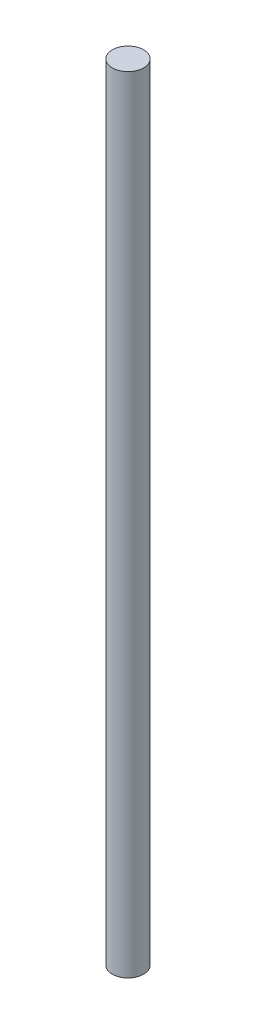
ISO-10303-21;
HEADER;
FILE_DESCRIPTION(('STEP AP214'),'2;1');
FILE_NAME('part.step','',(''),(''),'','','');
FILE_SCHEMA(('AUTOMOTIVE_DESIGN { 1 0 10303 214 1 1 1 1 }'));
ENDSEC;
DATA;
#1=APPLICATION_CONTEXT('core data for automotive mechanical design processes');
#2=APPLICATION_PROTOCOL_DEFINITION('international standard','automotive_design',2000,#1);
#3=PRODUCT_CONTEXT('',#1,'mechanical');
#4=PRODUCT('Part','Part','',(#3));
#5=PRODUCT_RELATED_PRODUCT_CATEGORY('part','',(#4));
#6=PRODUCT_DEFINITION_FORMATION('','',#4);
#7=PRODUCT_DEFINITION_CONTEXT('part definition',#1,'design');
#8=PRODUCT_DEFINITION('design','',#6,#7);
#9=PRODUCT_DEFINITION_SHAPE('','',#8);
#10=(LENGTH_UNIT() NAMED_UNIT(*) SI_UNIT(.MILLI.,.METRE.));
#11=(NAMED_UNIT(*) PLANE_ANGLE_UNIT() SI_UNIT($,.RADIAN.));
#12=(NAMED_UNIT(*) SI_UNIT($,.STERADIAN.) SOLID_ANGLE_UNIT());
#13=UNCERTAINTY_MEASURE_WITH_UNIT(LENGTH_MEASURE(1.E-05),#10,'distance_accuracy_value','');
#14=(GEOMETRIC_REPRESENTATION_CONTEXT(3) GLOBAL_UNCERTAINTY_ASSIGNED_CONTEXT((#13)) GLOBAL_UNIT_ASSIGNED_CONTEXT((#10,
#11,#12)) REPRESENTATION_CONTEXT('',''));
#15=CARTESIAN_POINT('',(0.,0.,0.));
#16=DIRECTION('',(0.,0.,1.));
#17=DIRECTION('',(1.,0.,0.));
#18=AXIS2_PLACEMENT_3D('',#15,#16,#17);
#19=CARTESIAN_POINT('',(0.,80.,0.));
#20=DIRECTION('',(0.,-1.,0.));
#21=DIRECTION('',(0.,0.,-1.));
#22=AXIS2_PLACEMENT_3D('',#19,#20,#21);
#23=CYLINDRICAL_SURFACE('',#22,1.6);
#24=CARTESIAN_POINT('',(0.,80.,0.));
#25=DIRECTION('',(0.,1.,0.));
#26=DIRECTION('',(0.,0.,1.));
#27=AXIS2_PLACEMENT_3D('',#24,#25,#26);
#28=CIRCLE('',#27,1.6);
#29=CARTESIAN_POINT('',(0.,80.,1.6));
#30=VERTEX_POINT('',#29);
#31=EDGE_CURVE('E10',#30,#30,#28,.T.);
#32=ORIENTED_EDGE('',*,*,#31,.F.);
#33=EDGE_LOOP('',(#32));
#34=FACE_BOUND('',#33,.T.);
#35=CARTESIAN_POINT('',(0.,0.,0.));
#36=DIRECTION('',(0.,1.,0.));
#37=DIRECTION('',(0.,0.,1.));
#38=AXIS2_PLACEMENT_3D('',#35,#36,#37);
#39=CIRCLE('',#38,1.6);
#40=CARTESIAN_POINT('',(0.,0.,1.6));
#41=VERTEX_POINT('',#40);
#42=EDGE_CURVE('E44',#41,#41,#39,.T.);
#43=ORIENTED_EDGE('',*,*,#42,.T.);
#44=EDGE_LOOP('',(#43));
#45=FACE_BOUND('',#44,.T.);
#46=ADVANCED_FACE('F41',(#34,#45),#23,.T.);
#47=CARTESIAN_POINT('',(0.,80.,0.));
#48=DIRECTION('',(0.,1.,0.));
#49=DIRECTION('',(0.,0.,1.));
#50=AXIS2_PLACEMENT_3D('',#47,#48,#49);
#51=PLANE('',#50);
#52=ORIENTED_EDGE('',*,*,#31,.T.);
#53=EDGE_LOOP('',(#52));
#54=FACE_BOUND('',#53,.T.);
#55=ADVANCED_FACE('F58',(#54),#51,.T.);
#56=CARTESIAN_POINT('',(0.,0.,0.));
#57=DIRECTION('',(0.,1.,0.));
#58=DIRECTION('',(0.,0.,1.));
#59=AXIS2_PLACEMENT_3D('',#56,#57,#58);
#60=PLANE('',#59);
#61=ORIENTED_EDGE('',*,*,#42,.F.);
#62=EDGE_LOOP('',(#61));
#63=FACE_BOUND('',#62,.T.);
#64=ADVANCED_FACE('F56',(#63),#60,.F.);
#65=CLOSED_SHELL('',(#46,#55,#64));
#66=MANIFOLD_SOLID_BREP('B2',#65);
#67=ADVANCED_BREP_SHAPE_REPRESENTATION('',(#18,#66),#14);
#68=SHAPE_DEFINITION_REPRESENTATION(#9,#67);
ENDSEC;
END-ISO-10303-21;
